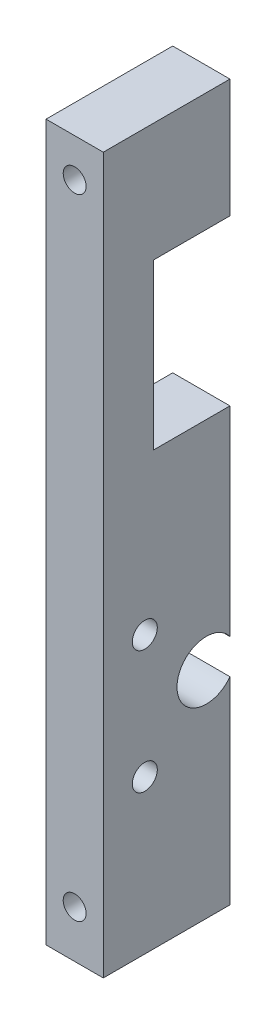
ISO-10303-21;
HEADER;
FILE_DESCRIPTION(('STEP AP214'),'2;1');
FILE_NAME('part.step','',(''),(''),'','','');
FILE_SCHEMA(('AUTOMOTIVE_DESIGN { 1 0 10303 214 1 1 1 1 }'));
ENDSEC;
DATA;
#1=APPLICATION_CONTEXT('core data for automotive mechanical design processes');
#2=APPLICATION_PROTOCOL_DEFINITION('international standard','automotive_design',2000,#1);
#3=PRODUCT_CONTEXT('',#1,'mechanical');
#4=PRODUCT('Part','Part','',(#3));
#5=PRODUCT_RELATED_PRODUCT_CATEGORY('part','',(#4));
#6=PRODUCT_DEFINITION_FORMATION('','',#4);
#7=PRODUCT_DEFINITION_CONTEXT('part definition',#1,'design');
#8=PRODUCT_DEFINITION('design','',#6,#7);
#9=PRODUCT_DEFINITION_SHAPE('','',#8);
#10=(LENGTH_UNIT() NAMED_UNIT(*) SI_UNIT(.MILLI.,.METRE.));
#11=(NAMED_UNIT(*) PLANE_ANGLE_UNIT() SI_UNIT($,.RADIAN.));
#12=(NAMED_UNIT(*) SI_UNIT($,.STERADIAN.) SOLID_ANGLE_UNIT());
#13=UNCERTAINTY_MEASURE_WITH_UNIT(LENGTH_MEASURE(1.E-05),#10,'distance_accuracy_value','');
#14=(GEOMETRIC_REPRESENTATION_CONTEXT(3) GLOBAL_UNCERTAINTY_ASSIGNED_CONTEXT((#13)) GLOBAL_UNIT_ASSIGNED_CONTEXT((#10,
#11,#12)) REPRESENTATION_CONTEXT('',''));
#15=CARTESIAN_POINT('',(0.,0.,0.));
#16=DIRECTION('',(0.,0.,1.));
#17=DIRECTION('',(1.,0.,0.));
#18=AXIS2_PLACEMENT_3D('',#15,#16,#17);
#19=CARTESIAN_POINT('',(0.,0.,2.248090434488));
#20=DIRECTION('',(0.,0.,-1.));
#21=DIRECTION('',(-1.,0.,0.));
#22=AXIS2_PLACEMENT_3D('',#19,#20,#21);
#23=PLANE('',#22);
#24=DIRECTION('',(-1.,0.,0.));
#25=VECTOR('',#24,1.);
#26=CARTESIAN_POINT('',(0.,25.9,2.248090434488));
#27=LINE('',#26,#25);
#28=CARTESIAN_POINT('',(53.65,25.9,2.248090434488));
#29=VERTEX_POINT('',#28);
#30=CARTESIAN_POINT('',(49.65,25.9,2.248090434488));
#31=VERTEX_POINT('',#30);
#32=EDGE_CURVE('E163',#29,#31,#27,.T.);
#33=ORIENTED_EDGE('',*,*,#32,.F.);
#34=DIRECTION('',(0.,1.,0.));
#35=VECTOR('',#34,1.);
#36=CARTESIAN_POINT('',(53.65,-4.3,2.248090434488));
#37=LINE('',#36,#35);
#38=CARTESIAN_POINT('',(53.65,11.9396433950694,2.248090434488));
#39=VERTEX_POINT('',#38);
#40=EDGE_CURVE('E230',#39,#29,#37,.T.);
#41=ORIENTED_EDGE('',*,*,#40,.F.);
#42=DIRECTION('',(1.,0.,0.));
#43=VECTOR('',#42,1.);
#44=CARTESIAN_POINT('',(49.65,11.9396433950694,2.248090434488));
#45=LINE('',#44,#43);
#46=CARTESIAN_POINT('',(49.65,11.9396433950694,2.248090434488));
#47=VERTEX_POINT('',#46);
#48=EDGE_CURVE('E56',#47,#39,#45,.T.);
#49=ORIENTED_EDGE('',*,*,#48,.F.);
#50=DIRECTION('',(0.,-1.,0.));
#51=VECTOR('',#50,1.);
#52=CARTESIAN_POINT('',(49.65,-4.3,2.248090434488));
#53=LINE('',#52,#51);
#54=EDGE_CURVE('E222',#31,#47,#53,.T.);
#55=ORIENTED_EDGE('',*,*,#54,.F.);
#56=EDGE_LOOP('',(#33,#41,#49,#55));
#57=FACE_BOUND('',#56,.T.);
#58=ADVANCED_FACE('F47',(#57),#23,.T.);
#59=DIRECTION('',(1.,0.,0.));
#60=VECTOR('',#59,1.);
#61=CARTESIAN_POINT('',(0.,37.4,2.248090434488));
#62=LINE('',#61,#60);
#63=CARTESIAN_POINT('',(49.65,37.4,2.248090434488));
#64=VERTEX_POINT('',#63);
#65=CARTESIAN_POINT('',(53.65,37.4,2.248090434488));
#66=VERTEX_POINT('',#65);
#67=EDGE_CURVE('E63',#64,#66,#62,.T.);
#68=ORIENTED_EDGE('',*,*,#67,.F.);
#69=CARTESIAN_POINT('',(49.65,45.68,2.248090434488));
#70=VERTEX_POINT('',#69);
#71=EDGE_CURVE('E145',#70,#64,#53,.T.);
#72=ORIENTED_EDGE('',*,*,#71,.F.);
#73=DIRECTION('',(-1.,0.,0.));
#74=VECTOR('',#73,1.);
#75=CARTESIAN_POINT('',(49.65,45.68,2.248090434488));
#76=LINE('',#75,#74);
#77=CARTESIAN_POINT('',(53.65,45.68,2.248090434488));
#78=VERTEX_POINT('',#77);
#79=EDGE_CURVE('E209',#78,#70,#76,.T.);
#80=ORIENTED_EDGE('',*,*,#79,.F.);
#81=EDGE_CURVE('E225',#66,#78,#37,.T.);
#82=ORIENTED_EDGE('',*,*,#81,.F.);
#83=EDGE_LOOP('',(#68,#72,#80,#82));
#84=FACE_BOUND('',#83,.T.);
#85=CARTESIAN_POINT('',(51.65,43.,2.248090434488));
#86=DIRECTION('',(0.,0.,1.));
#87=DIRECTION('',(1.,0.,0.));
#88=AXIS2_PLACEMENT_3D('',#85,#86,#87);
#89=CIRCLE('',#88,0.800000000000002);
#90=CARTESIAN_POINT('',(52.45,43.,2.248090434488));
#91=VERTEX_POINT('',#90);
#92=EDGE_CURVE('E186',#91,#91,#89,.T.);
#93=ORIENTED_EDGE('',*,*,#92,.T.);
#94=EDGE_LOOP('',(#93));
#95=FACE_BOUND('',#94,.T.);
#96=ADVANCED_FACE('F273',(#84,#95),#23,.T.);
#97=CARTESIAN_POINT('',(49.65,-4.3,11.1));
#98=DIRECTION('',(1.,0.,0.));
#99=DIRECTION('',(0.,0.,-1.));
#100=AXIS2_PLACEMENT_3D('',#97,#98,#99);
#101=PLANE('',#100);
#102=CARTESIAN_POINT('',(49.65,6.425,8.1994963273));
#103=DIRECTION('',(1.,0.,0.));
#104=DIRECTION('',(0.,0.,-1.));
#105=AXIS2_PLACEMENT_3D('',#102,#103,#104);
#106=CIRCLE('',#105,0.875);
#107=CARTESIAN_POINT('',(49.65,6.425,7.3244963273));
#108=VERTEX_POINT('',#107);
#109=EDGE_CURVE('E167',#108,#108,#106,.T.);
#110=ORIENTED_EDGE('',*,*,#109,.T.);
#111=EDGE_LOOP('',(#110));
#112=FACE_BOUND('',#111,.T.);
#113=CARTESIAN_POINT('',(49.65,15.025,8.1994963273));
#114=DIRECTION('',(1.,0.,0.));
#115=DIRECTION('',(0.,0.,-1.));
#116=AXIS2_PLACEMENT_3D('',#113,#114,#115);
#117=CIRCLE('',#116,0.875);
#118=CARTESIAN_POINT('',(49.65,15.025,7.3244963273));
#119=VERTEX_POINT('',#118);
#120=EDGE_CURVE('E166',#119,#119,#117,.T.);
#121=ORIENTED_EDGE('',*,*,#120,.T.);
#122=EDGE_LOOP('',(#121));
#123=FACE_BOUND('',#122,.T.);
#124=DIRECTION('',(0.,-1.,0.));
#125=VECTOR('',#124,1.);
#126=CARTESIAN_POINT('',(49.65,25.9,7.6));
#127=LINE('',#126,#125);
#128=CARTESIAN_POINT('',(49.65,37.4,7.6));
#129=VERTEX_POINT('',#128);
#130=CARTESIAN_POINT('',(49.65,25.9,7.6));
#131=VERTEX_POINT('',#130);
#132=EDGE_CURVE('E135',#129,#131,#127,.T.);
#133=ORIENTED_EDGE('',*,*,#132,.T.);
#134=DIRECTION('',(0.,0.,-1.));
#135=VECTOR('',#134,1.);
#136=CARTESIAN_POINT('',(49.65,25.9,0.9));
#137=LINE('',#136,#135);
#138=EDGE_CURVE('E132',#131,#31,#137,.T.);
#139=ORIENTED_EDGE('',*,*,#138,.T.);
#140=ORIENTED_EDGE('',*,*,#54,.T.);
#141=CARTESIAN_POINT('',(49.65,10.725,3.8994963273));
#142=DIRECTION('',(1.,0.,0.));
#143=DIRECTION('',(0.,0.,-1.));
#144=AXIS2_PLACEMENT_3D('',#141,#142,#143);
#145=CIRCLE('',#144,2.05);
#146=CARTESIAN_POINT('',(49.65,9.51035660493057,2.248090434488));
#147=VERTEX_POINT('',#146);
#148=EDGE_CURVE('E182',#47,#147,#145,.T.);
#149=ORIENTED_EDGE('',*,*,#148,.T.);
#150=CARTESIAN_POINT('',(49.65,-4.3,2.248090434488));
#151=VERTEX_POINT('',#150);
#152=EDGE_CURVE('E193',#147,#151,#53,.T.);
#153=ORIENTED_EDGE('',*,*,#152,.T.);
#154=DIRECTION('',(0.,0.,-1.));
#155=VECTOR('',#154,1.);
#156=CARTESIAN_POINT('',(49.65,-4.3,11.1));
#157=LINE('',#156,#155);
#158=CARTESIAN_POINT('',(49.65,-4.3,11.1));
#159=VERTEX_POINT('',#158);
#160=EDGE_CURVE('E243',#159,#151,#157,.T.);
#161=ORIENTED_EDGE('',*,*,#160,.F.);
#162=DIRECTION('',(0.,-1.,0.));
#163=VECTOR('',#162,1.);
#164=CARTESIAN_POINT('',(49.65,-4.3,11.1));
#165=LINE('',#164,#163);
#166=CARTESIAN_POINT('',(49.65,45.68,11.1));
#167=VERTEX_POINT('',#166);
#168=EDGE_CURVE('E204',#167,#159,#165,.T.);
#169=ORIENTED_EDGE('',*,*,#168,.F.);
#170=DIRECTION('',(0.,0.,-1.));
#171=VECTOR('',#170,1.);
#172=CARTESIAN_POINT('',(49.65,45.68,11.1));
#173=LINE('',#172,#171);
#174=EDGE_CURVE('E218',#167,#70,#173,.T.);
#175=ORIENTED_EDGE('',*,*,#174,.T.);
#176=ORIENTED_EDGE('',*,*,#71,.T.);
#177=DIRECTION('',(0.,0.,1.));
#178=VECTOR('',#177,1.);
#179=CARTESIAN_POINT('',(49.65,37.4,0.9));
#180=LINE('',#179,#178);
#181=EDGE_CURVE('E126',#64,#129,#180,.T.);
#182=ORIENTED_EDGE('',*,*,#181,.T.);
#183=EDGE_LOOP('',(#133,#139,#140,#149,#153,#161,#169,#175,#176,#182));
#184=FACE_BOUND('',#183,.T.);
#185=ADVANCED_FACE('F49',(#112,#123,#184),#101,.F.);
#186=CARTESIAN_POINT('',(49.65,-4.3,11.1));
#187=DIRECTION('',(0.,1.,0.));
#188=DIRECTION('',(0.,0.,1.));
#189=AXIS2_PLACEMENT_3D('',#186,#187,#188);
#190=PLANE('',#189);
#191=DIRECTION('',(1.,0.,0.));
#192=VECTOR('',#191,1.);
#193=CARTESIAN_POINT('',(49.65,-4.3,2.248090434488));
#194=LINE('',#193,#192);
#195=CARTESIAN_POINT('',(53.65,-4.3,2.248090434488));
#196=VERTEX_POINT('',#195);
#197=EDGE_CURVE('E221',#151,#196,#194,.T.);
#198=ORIENTED_EDGE('',*,*,#197,.T.);
#199=DIRECTION('',(0.,0.,-1.));
#200=VECTOR('',#199,1.);
#201=CARTESIAN_POINT('',(53.65,-4.3,11.1));
#202=LINE('',#201,#200);
#203=CARTESIAN_POINT('',(53.65,-4.3,11.1));
#204=VERTEX_POINT('',#203);
#205=EDGE_CURVE('E239',#204,#196,#202,.T.);
#206=ORIENTED_EDGE('',*,*,#205,.F.);
#207=DIRECTION('',(1.,0.,0.));
#208=VECTOR('',#207,1.);
#209=CARTESIAN_POINT('',(49.65,-4.3,11.1));
#210=LINE('',#209,#208);
#211=EDGE_CURVE('E208',#159,#204,#210,.T.);
#212=ORIENTED_EDGE('',*,*,#211,.F.);
#213=ORIENTED_EDGE('',*,*,#160,.T.);
#214=EDGE_LOOP('',(#198,#206,#212,#213));
#215=FACE_BOUND('',#214,.T.);
#216=ADVANCED_FACE('F298',(#215),#190,.F.);
#217=CARTESIAN_POINT('',(53.65,-4.3,11.1));
#218=DIRECTION('',(-1.,0.,0.));
#219=DIRECTION('',(0.,0.,1.));
#220=AXIS2_PLACEMENT_3D('',#217,#218,#219);
#221=PLANE('',#220);
#222=CARTESIAN_POINT('',(53.65,6.425,8.1994963273));
#223=DIRECTION('',(1.,0.,0.));
#224=DIRECTION('',(0.,0.,-1.));
#225=AXIS2_PLACEMENT_3D('',#222,#223,#224);
#226=CIRCLE('',#225,0.875);
#227=CARTESIAN_POINT('',(53.65,6.425,7.3244963273));
#228=VERTEX_POINT('',#227);
#229=EDGE_CURVE('E171',#228,#228,#226,.T.);
#230=ORIENTED_EDGE('',*,*,#229,.F.);
#231=EDGE_LOOP('',(#230));
#232=FACE_BOUND('',#231,.T.);
#233=CARTESIAN_POINT('',(53.65,15.025,8.1994963273));
#234=DIRECTION('',(1.,0.,0.));
#235=DIRECTION('',(0.,0.,-1.));
#236=AXIS2_PLACEMENT_3D('',#233,#234,#235);
#237=CIRCLE('',#236,0.875);
#238=CARTESIAN_POINT('',(53.65,15.025,7.3244963273));
#239=VERTEX_POINT('',#238);
#240=EDGE_CURVE('E175',#239,#239,#237,.T.);
#241=ORIENTED_EDGE('',*,*,#240,.F.);
#242=EDGE_LOOP('',(#241));
#243=FACE_BOUND('',#242,.T.);
#244=ORIENTED_EDGE('',*,*,#40,.T.);
#245=DIRECTION('',(0.,0.,-1.));
#246=VECTOR('',#245,1.);
#247=CARTESIAN_POINT('',(53.65,25.9,0.9));
#248=LINE('',#247,#246);
#249=CARTESIAN_POINT('',(53.65,25.9,7.6));
#250=VERTEX_POINT('',#249);
#251=EDGE_CURVE('E147',#250,#29,#248,.T.);
#252=ORIENTED_EDGE('',*,*,#251,.F.);
#253=DIRECTION('',(0.,-1.,0.));
#254=VECTOR('',#253,1.);
#255=CARTESIAN_POINT('',(53.65,25.9,7.6));
#256=LINE('',#255,#254);
#257=CARTESIAN_POINT('',(53.65,37.4,7.6));
#258=VERTEX_POINT('',#257);
#259=EDGE_CURVE('E152',#258,#250,#256,.T.);
#260=ORIENTED_EDGE('',*,*,#259,.F.);
#261=DIRECTION('',(0.,0.,-1.));
#262=VECTOR('',#261,1.);
#263=CARTESIAN_POINT('',(53.65,37.4,11.1));
#264=LINE('',#263,#262);
#265=EDGE_CURVE('E11',#258,#66,#264,.T.);
#266=ORIENTED_EDGE('',*,*,#265,.T.);
#267=ORIENTED_EDGE('',*,*,#81,.T.);
#268=DIRECTION('',(0.,0.,-1.));
#269=VECTOR('',#268,1.);
#270=CARTESIAN_POINT('',(53.65,45.68,11.1));
#271=LINE('',#270,#269);
#272=CARTESIAN_POINT('',(53.65,45.68,11.1));
#273=VERTEX_POINT('',#272);
#274=EDGE_CURVE('E235',#273,#78,#271,.T.);
#275=ORIENTED_EDGE('',*,*,#274,.F.);
#276=DIRECTION('',(0.,1.,0.));
#277=VECTOR('',#276,1.);
#278=CARTESIAN_POINT('',(53.65,-4.3,11.1));
#279=LINE('',#278,#277);
#280=EDGE_CURVE('E212',#204,#273,#279,.T.);
#281=ORIENTED_EDGE('',*,*,#280,.F.);
#282=ORIENTED_EDGE('',*,*,#205,.T.);
#283=CARTESIAN_POINT('',(53.65,9.51035660493057,2.248090434488));
#284=VERTEX_POINT('',#283);
#285=EDGE_CURVE('E226',#196,#284,#37,.T.);
#286=ORIENTED_EDGE('',*,*,#285,.T.);
#287=CARTESIAN_POINT('',(53.65,10.725,3.8994963273));
#288=DIRECTION('',(1.,0.,0.));
#289=DIRECTION('',(0.,0.,-1.));
#290=AXIS2_PLACEMENT_3D('',#287,#288,#289);
#291=CIRCLE('',#290,2.05);
#292=EDGE_CURVE('E70',#39,#284,#291,.T.);
#293=ORIENTED_EDGE('',*,*,#292,.F.);
#294=EDGE_LOOP('',(#244,#252,#260,#266,#267,#275,#281,#282,#286,#293));
#295=FACE_BOUND('',#294,.T.);
#296=ADVANCED_FACE('F259',(#232,#243,#295),#221,.F.);
#297=CARTESIAN_POINT('',(49.65,45.68,11.1));
#298=DIRECTION('',(0.,-1.,0.));
#299=DIRECTION('',(0.,0.,-1.));
#300=AXIS2_PLACEMENT_3D('',#297,#298,#299);
#301=PLANE('',#300);
#302=ORIENTED_EDGE('',*,*,#79,.T.);
#303=ORIENTED_EDGE('',*,*,#174,.F.);
#304=DIRECTION('',(-1.,0.,0.));
#305=VECTOR('',#304,1.);
#306=CARTESIAN_POINT('',(49.65,45.68,11.1));
#307=LINE('',#306,#305);
#308=EDGE_CURVE('E215',#273,#167,#307,.T.);
#309=ORIENTED_EDGE('',*,*,#308,.F.);
#310=ORIENTED_EDGE('',*,*,#274,.T.);
#311=EDGE_LOOP('',(#302,#303,#309,#310));
#312=FACE_BOUND('',#311,.T.);
#313=ADVANCED_FACE('F271',(#312),#301,.F.);
#314=CARTESIAN_POINT('',(0.,0.,11.1));
#315=DIRECTION('',(0.,0.,-1.));
#316=DIRECTION('',(-1.,0.,0.));
#317=AXIS2_PLACEMENT_3D('',#314,#315,#316);
#318=PLANE('',#317);
#319=CARTESIAN_POINT('',(51.65,-1.,11.1));
#320=DIRECTION('',(0.,0.,1.));
#321=DIRECTION('',(1.,0.,0.));
#322=AXIS2_PLACEMENT_3D('',#319,#320,#321);
#323=CIRCLE('',#322,0.800000000000002);
#324=CARTESIAN_POINT('',(52.45,-1.,11.1));
#325=VERTEX_POINT('',#324);
#326=EDGE_CURVE('E194',#325,#325,#323,.T.);
#327=ORIENTED_EDGE('',*,*,#326,.F.);
#328=EDGE_LOOP('',(#327));
#329=FACE_BOUND('',#328,.T.);
#330=CARTESIAN_POINT('',(51.65,43.,11.1));
#331=DIRECTION('',(0.,0.,1.));
#332=DIRECTION('',(1.,0.,0.));
#333=AXIS2_PLACEMENT_3D('',#330,#331,#332);
#334=CIRCLE('',#333,0.800000000000002);
#335=CARTESIAN_POINT('',(52.45,43.,11.1));
#336=VERTEX_POINT('',#335);
#337=EDGE_CURVE('E197',#336,#336,#334,.T.);
#338=ORIENTED_EDGE('',*,*,#337,.F.);
#339=EDGE_LOOP('',(#338));
#340=FACE_BOUND('',#339,.T.);
#341=ORIENTED_EDGE('',*,*,#168,.T.);
#342=ORIENTED_EDGE('',*,*,#211,.T.);
#343=ORIENTED_EDGE('',*,*,#280,.T.);
#344=ORIENTED_EDGE('',*,*,#308,.T.);
#345=EDGE_LOOP('',(#341,#342,#343,#344));
#346=FACE_BOUND('',#345,.T.);
#347=ADVANCED_FACE('F287',(#329,#340,#346),#318,.F.);
#348=DIRECTION('',(1.,0.,0.));
#349=VECTOR('',#348,1.);
#350=CARTESIAN_POINT('',(49.65,9.51035660493057,2.248090434488));
#351=LINE('',#350,#349);
#352=EDGE_CURVE('E247',#284,#147,#351,.F.);
#353=ORIENTED_EDGE('',*,*,#352,.F.);
#354=ORIENTED_EDGE('',*,*,#285,.F.);
#355=ORIENTED_EDGE('',*,*,#197,.F.);
#356=ORIENTED_EDGE('',*,*,#152,.F.);
#357=EDGE_LOOP('',(#353,#354,#355,#356));
#358=FACE_BOUND('',#357,.T.);
#359=CARTESIAN_POINT('',(51.65,-1.,2.248090434488));
#360=DIRECTION('',(0.,0.,1.));
#361=DIRECTION('',(1.,0.,0.));
#362=AXIS2_PLACEMENT_3D('',#359,#360,#361);
#363=CIRCLE('',#362,0.800000000000002);
#364=CARTESIAN_POINT('',(52.45,-1.,2.248090434488));
#365=VERTEX_POINT('',#364);
#366=EDGE_CURVE('E189',#365,#365,#363,.T.);
#367=ORIENTED_EDGE('',*,*,#366,.T.);
#368=EDGE_LOOP('',(#367));
#369=FACE_BOUND('',#368,.T.);
#370=ADVANCED_FACE('F277',(#358,#369),#23,.T.);
#371=CARTESIAN_POINT('',(51.65,43.,2.248090434488));
#372=DIRECTION('',(0.,0.,1.));
#373=DIRECTION('',(1.,0.,0.));
#374=AXIS2_PLACEMENT_3D('',#371,#372,#373);
#375=CYLINDRICAL_SURFACE('',#374,0.800000000000002);
#376=ORIENTED_EDGE('',*,*,#92,.F.);
#377=EDGE_LOOP('',(#376));
#378=FACE_BOUND('',#377,.T.);
#379=ORIENTED_EDGE('',*,*,#337,.T.);
#380=EDGE_LOOP('',(#379));
#381=FACE_BOUND('',#380,.T.);
#382=ADVANCED_FACE('F280',(#378,#381),#375,.F.);
#383=CARTESIAN_POINT('',(51.65,-1.,2.248090434488));
#384=DIRECTION('',(0.,0.,1.));
#385=DIRECTION('',(1.,0.,0.));
#386=AXIS2_PLACEMENT_3D('',#383,#384,#385);
#387=CYLINDRICAL_SURFACE('',#386,0.800000000000002);
#388=ORIENTED_EDGE('',*,*,#366,.F.);
#389=EDGE_LOOP('',(#388));
#390=FACE_BOUND('',#389,.T.);
#391=ORIENTED_EDGE('',*,*,#326,.T.);
#392=EDGE_LOOP('',(#391));
#393=FACE_BOUND('',#392,.T.);
#394=ADVANCED_FACE('F283',(#390,#393),#387,.F.);
#395=CARTESIAN_POINT('',(49.65,10.725,3.8994963273));
#396=DIRECTION('',(1.,0.,0.));
#397=DIRECTION('',(0.,0.,-1.));
#398=AXIS2_PLACEMENT_3D('',#395,#396,#397);
#399=CYLINDRICAL_SURFACE('',#398,2.05);
#400=ORIENTED_EDGE('',*,*,#48,.T.);
#401=ORIENTED_EDGE('',*,*,#292,.T.);
#402=ORIENTED_EDGE('',*,*,#352,.T.);
#403=ORIENTED_EDGE('',*,*,#148,.F.);
#404=EDGE_LOOP('',(#400,#401,#402,#403));
#405=FACE_BOUND('',#404,.T.);
#406=ADVANCED_FACE('F253',(#405),#399,.F.);
#407=CARTESIAN_POINT('',(49.65,15.025,8.1994963273));
#408=DIRECTION('',(1.,0.,0.));
#409=DIRECTION('',(0.,0.,-1.));
#410=AXIS2_PLACEMENT_3D('',#407,#408,#409);
#411=CYLINDRICAL_SURFACE('',#410,0.875);
#412=ORIENTED_EDGE('',*,*,#120,.F.);
#413=EDGE_LOOP('',(#412));
#414=FACE_BOUND('',#413,.T.);
#415=ORIENTED_EDGE('',*,*,#240,.T.);
#416=EDGE_LOOP('',(#415));
#417=FACE_BOUND('',#416,.T.);
#418=ADVANCED_FACE('F311',(#414,#417),#411,.F.);
#419=CARTESIAN_POINT('',(49.65,6.425,8.1994963273));
#420=DIRECTION('',(1.,0.,0.));
#421=DIRECTION('',(0.,0.,-1.));
#422=AXIS2_PLACEMENT_3D('',#419,#420,#421);
#423=CYLINDRICAL_SURFACE('',#422,0.875);
#424=ORIENTED_EDGE('',*,*,#109,.F.);
#425=EDGE_LOOP('',(#424));
#426=FACE_BOUND('',#425,.T.);
#427=ORIENTED_EDGE('',*,*,#229,.T.);
#428=EDGE_LOOP('',(#427));
#429=FACE_BOUND('',#428,.T.);
#430=ADVANCED_FACE('F305',(#426,#429),#423,.F.);
#431=CARTESIAN_POINT('',(49.65,25.9,0.9));
#432=DIRECTION('',(0.,-1.,0.));
#433=DIRECTION('',(0.,0.,-1.));
#434=AXIS2_PLACEMENT_3D('',#431,#432,#433);
#435=PLANE('',#434);
#436=ORIENTED_EDGE('',*,*,#32,.T.);
#437=ORIENTED_EDGE('',*,*,#138,.F.);
#438=DIRECTION('',(1.,0.,0.));
#439=VECTOR('',#438,1.);
#440=CARTESIAN_POINT('',(49.65,25.9,7.6));
#441=LINE('',#440,#439);
#442=EDGE_CURVE('E131',#131,#250,#441,.T.);
#443=ORIENTED_EDGE('',*,*,#442,.T.);
#444=ORIENTED_EDGE('',*,*,#251,.T.);
#445=EDGE_LOOP('',(#436,#437,#443,#444));
#446=FACE_BOUND('',#445,.T.);
#447=ADVANCED_FACE('F303',(#446),#435,.F.);
#448=CARTESIAN_POINT('',(49.65,25.9,7.6));
#449=DIRECTION('',(0.,0.,1.));
#450=DIRECTION('',(1.,0.,0.));
#451=AXIS2_PLACEMENT_3D('',#448,#449,#450);
#452=PLANE('',#451);
#453=ORIENTED_EDGE('',*,*,#259,.T.);
#454=ORIENTED_EDGE('',*,*,#442,.F.);
#455=ORIENTED_EDGE('',*,*,#132,.F.);
#456=DIRECTION('',(1.,0.,0.));
#457=VECTOR('',#456,1.);
#458=CARTESIAN_POINT('',(49.65,37.4,7.6));
#459=LINE('',#458,#457);
#460=EDGE_CURVE('E122',#129,#258,#459,.T.);
#461=ORIENTED_EDGE('',*,*,#460,.T.);
#462=EDGE_LOOP('',(#453,#454,#455,#461));
#463=FACE_BOUND('',#462,.T.);
#464=ADVANCED_FACE('F136',(#463),#452,.F.);
#465=CARTESIAN_POINT('',(49.65,37.4,0.9));
#466=DIRECTION('',(0.,1.,0.));
#467=DIRECTION('',(0.,0.,1.));
#468=AXIS2_PLACEMENT_3D('',#465,#466,#467);
#469=PLANE('',#468);
#470=ORIENTED_EDGE('',*,*,#67,.T.);
#471=ORIENTED_EDGE('',*,*,#265,.F.);
#472=ORIENTED_EDGE('',*,*,#460,.F.);
#473=ORIENTED_EDGE('',*,*,#181,.F.);
#474=EDGE_LOOP('',(#470,#471,#472,#473));
#475=FACE_BOUND('',#474,.T.);
#476=ADVANCED_FACE('F124',(#475),#469,.F.);
#477=CLOSED_SHELL('',(#58,#96,#185,#216,#296,#313,#347,#370,#382,#394,#406,#418,#430,#447,#464,#476));
#478=MANIFOLD_SOLID_BREP('B2',#477);
#479=ADVANCED_BREP_SHAPE_REPRESENTATION('',(#18,#478),#14);
#480=SHAPE_DEFINITION_REPRESENTATION(#9,#479);
ENDSEC;
END-ISO-10303-21;
